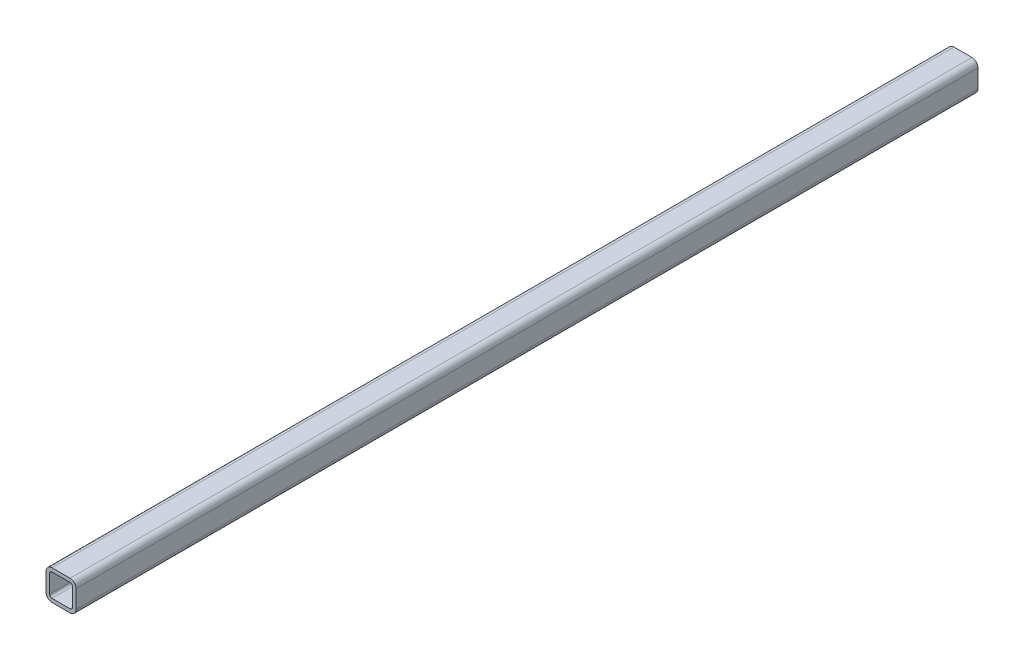
ISO-10303-21;
HEADER;
FILE_DESCRIPTION(('STEP AP214'),'2;1');
FILE_NAME('part.step','',(''),(''),'','','');
FILE_SCHEMA(('AUTOMOTIVE_DESIGN { 1 0 10303 214 1 1 1 1 }'));
ENDSEC;
DATA;
#1=APPLICATION_CONTEXT('core data for automotive mechanical design processes');
#2=APPLICATION_PROTOCOL_DEFINITION('international standard','automotive_design',2000,#1);
#3=PRODUCT_CONTEXT('',#1,'mechanical');
#4=PRODUCT('Part','Part','',(#3));
#5=PRODUCT_RELATED_PRODUCT_CATEGORY('part','',(#4));
#6=PRODUCT_DEFINITION_FORMATION('','',#4);
#7=PRODUCT_DEFINITION_CONTEXT('part definition',#1,'design');
#8=PRODUCT_DEFINITION('design','',#6,#7);
#9=PRODUCT_DEFINITION_SHAPE('','',#8);
#10=(LENGTH_UNIT() NAMED_UNIT(*) SI_UNIT(.MILLI.,.METRE.));
#11=(NAMED_UNIT(*) PLANE_ANGLE_UNIT() SI_UNIT($,.RADIAN.));
#12=(NAMED_UNIT(*) SI_UNIT($,.STERADIAN.) SOLID_ANGLE_UNIT());
#13=UNCERTAINTY_MEASURE_WITH_UNIT(LENGTH_MEASURE(1.E-05),#10,'distance_accuracy_value','');
#14=(GEOMETRIC_REPRESENTATION_CONTEXT(3) GLOBAL_UNCERTAINTY_ASSIGNED_CONTEXT((#13)) GLOBAL_UNIT_ASSIGNED_CONTEXT((#10,
#11,#12)) REPRESENTATION_CONTEXT('',''));
#15=CARTESIAN_POINT('',(0.,0.,0.));
#16=DIRECTION('',(0.,0.,1.));
#17=DIRECTION('',(1.,0.,0.));
#18=AXIS2_PLACEMENT_3D('',#15,#16,#17);
#19=CARTESIAN_POINT('',(7.5,7.5,750.));
#20=DIRECTION('',(0.,0.,-1.));
#21=DIRECTION('',(-1.,0.,0.));
#22=AXIS2_PLACEMENT_3D('',#19,#20,#21);
#23=PLANE('',#22);
#24=CARTESIAN_POINT('',(7.5,7.5,750.));
#25=DIRECTION('',(0.,0.,1.));
#26=DIRECTION('',(-1.,0.,0.));
#27=AXIS2_PLACEMENT_3D('',#24,#25,#26);
#28=CIRCLE('',#27,5.);
#29=CARTESIAN_POINT('',(12.5,7.49999999999997,750.));
#30=VERTEX_POINT('',#29);
#31=CARTESIAN_POINT('',(7.49999999999997,12.5,750.));
#32=VERTEX_POINT('',#31);
#33=EDGE_CURVE('E211',#30,#32,#28,.T.);
#34=ORIENTED_EDGE('',*,*,#33,.T.);
#35=DIRECTION('',(-1.,0.,0.));
#36=VECTOR('',#35,1.);
#37=CARTESIAN_POINT('',(-7.49999999999997,12.5,750.));
#38=LINE('',#37,#36);
#39=CARTESIAN_POINT('',(-7.49999999999997,12.5,750.));
#40=VERTEX_POINT('',#39);
#41=EDGE_CURVE('E214',#32,#40,#38,.T.);
#42=ORIENTED_EDGE('',*,*,#41,.T.);
#43=CARTESIAN_POINT('',(-7.5,7.5,750.));
#44=DIRECTION('',(0.,0.,1.));
#45=DIRECTION('',(-1.,0.,0.));
#46=AXIS2_PLACEMENT_3D('',#43,#44,#45);
#47=CIRCLE('',#46,5.);
#48=CARTESIAN_POINT('',(-12.5,7.49999999999997,750.));
#49=VERTEX_POINT('',#48);
#50=EDGE_CURVE('E217',#40,#49,#47,.T.);
#51=ORIENTED_EDGE('',*,*,#50,.T.);
#52=DIRECTION('',(0.,-1.,0.));
#53=VECTOR('',#52,1.);
#54=CARTESIAN_POINT('',(-12.5,-7.49999999999997,750.));
#55=LINE('',#54,#53);
#56=CARTESIAN_POINT('',(-12.5,-7.49999999999997,750.));
#57=VERTEX_POINT('',#56);
#58=EDGE_CURVE('E219',#49,#57,#55,.T.);
#59=ORIENTED_EDGE('',*,*,#58,.T.);
#60=CARTESIAN_POINT('',(-7.5,-7.5,750.));
#61=DIRECTION('',(0.,0.,1.));
#62=DIRECTION('',(-1.,0.,0.));
#63=AXIS2_PLACEMENT_3D('',#60,#61,#62);
#64=CIRCLE('',#63,5.);
#65=CARTESIAN_POINT('',(-7.49999999999997,-12.5,750.));
#66=VERTEX_POINT('',#65);
#67=EDGE_CURVE('E221',#57,#66,#64,.T.);
#68=ORIENTED_EDGE('',*,*,#67,.T.);
#69=DIRECTION('',(1.,0.,0.));
#70=VECTOR('',#69,1.);
#71=CARTESIAN_POINT('',(-7.49999999999997,-12.5,750.));
#72=LINE('',#71,#70);
#73=CARTESIAN_POINT('',(7.49999999999997,-12.5,750.));
#74=VERTEX_POINT('',#73);
#75=EDGE_CURVE('E223',#66,#74,#72,.T.);
#76=ORIENTED_EDGE('',*,*,#75,.T.);
#77=CARTESIAN_POINT('',(7.5,-7.5,750.));
#78=DIRECTION('',(0.,0.,1.));
#79=DIRECTION('',(1.,0.,0.));
#80=AXIS2_PLACEMENT_3D('',#77,#78,#79);
#81=CIRCLE('',#80,5.);
#82=CARTESIAN_POINT('',(12.5,-7.5,750.));
#83=VERTEX_POINT('',#82);
#84=EDGE_CURVE('E225',#74,#83,#81,.T.);
#85=ORIENTED_EDGE('',*,*,#84,.T.);
#86=DIRECTION('',(0.,1.,0.));
#87=VECTOR('',#86,1.);
#88=CARTESIAN_POINT('',(12.5,-7.49999999999997,750.));
#89=LINE('',#88,#87);
#90=EDGE_CURVE('E227',#83,#30,#89,.T.);
#91=ORIENTED_EDGE('',*,*,#90,.T.);
#92=EDGE_LOOP('',(#34,#42,#51,#59,#68,#76,#85,#91));
#93=FACE_BOUND('',#92,.T.);
#94=CARTESIAN_POINT('',(-7.49999999999999,-7.49999999999997,750.));
#95=DIRECTION('',(0.,0.,1.));
#96=DIRECTION('',(1.,0.,0.));
#97=AXIS2_PLACEMENT_3D('',#94,#95,#96);
#98=CIRCLE('',#97,2.);
#99=CARTESIAN_POINT('',(-9.49999999999999,-7.49999999999995,750.));
#100=VERTEX_POINT('',#99);
#101=CARTESIAN_POINT('',(-7.49999999999997,-9.49999999999997,750.));
#102=VERTEX_POINT('',#101);
#103=EDGE_CURVE('E146',#100,#102,#98,.T.);
#104=ORIENTED_EDGE('',*,*,#103,.F.);
#105=DIRECTION('',(0.,-1.,0.));
#106=VECTOR('',#105,1.);
#107=CARTESIAN_POINT('',(-9.49999999999999,7.49999999999998,750.));
#108=LINE('',#107,#106);
#109=CARTESIAN_POINT('',(-9.49999999999999,7.49999999999998,750.));
#110=VERTEX_POINT('',#109);
#111=EDGE_CURVE('E179',#110,#100,#108,.T.);
#112=ORIENTED_EDGE('',*,*,#111,.F.);
#113=CARTESIAN_POINT('',(-7.49999999999999,7.49999999999999,750.));
#114=DIRECTION('',(0.,0.,1.));
#115=DIRECTION('',(-1.,0.,0.));
#116=AXIS2_PLACEMENT_3D('',#113,#114,#115);
#117=CIRCLE('',#116,2.);
#118=CARTESIAN_POINT('',(-7.49999999999997,9.49999999999999,750.));
#119=VERTEX_POINT('',#118);
#120=EDGE_CURVE('E177',#119,#110,#117,.T.);
#121=ORIENTED_EDGE('',*,*,#120,.F.);
#122=DIRECTION('',(-1.,0.,0.));
#123=VECTOR('',#122,1.);
#124=CARTESIAN_POINT('',(7.49999999999994,9.49999999999996,750.));
#125=LINE('',#124,#123);
#126=CARTESIAN_POINT('',(7.49999999999994,9.49999999999996,750.));
#127=VERTEX_POINT('',#126);
#128=EDGE_CURVE('E175',#127,#119,#125,.T.);
#129=ORIENTED_EDGE('',*,*,#128,.F.);
#130=CARTESIAN_POINT('',(7.49999999999995,7.49999999999996,750.));
#131=DIRECTION('',(0.,0.,1.));
#132=DIRECTION('',(1.,0.,0.));
#133=AXIS2_PLACEMENT_3D('',#130,#131,#132);
#134=CIRCLE('',#133,2.);
#135=CARTESIAN_POINT('',(9.49999999999995,7.49999999999994,750.));
#136=VERTEX_POINT('',#135);
#137=EDGE_CURVE('E173',#136,#127,#134,.T.);
#138=ORIENTED_EDGE('',*,*,#137,.F.);
#139=DIRECTION('',(0.,1.,0.));
#140=VECTOR('',#139,1.);
#141=CARTESIAN_POINT('',(9.49999999999995,-7.49999999999995,750.));
#142=LINE('',#141,#140);
#143=CARTESIAN_POINT('',(9.49999999999995,-7.49999999999995,750.));
#144=VERTEX_POINT('',#143);
#145=EDGE_CURVE('E169',#144,#136,#142,.T.);
#146=ORIENTED_EDGE('',*,*,#145,.F.);
#147=CARTESIAN_POINT('',(7.49999999999995,-7.49999999999997,750.));
#148=DIRECTION('',(0.,0.,1.));
#149=DIRECTION('',(1.,0.,0.));
#150=AXIS2_PLACEMENT_3D('',#147,#148,#149);
#151=CIRCLE('',#150,2.);
#152=CARTESIAN_POINT('',(7.49999999999994,-9.49999999999997,750.));
#153=VERTEX_POINT('',#152);
#154=EDGE_CURVE('E167',#153,#144,#151,.T.);
#155=ORIENTED_EDGE('',*,*,#154,.F.);
#156=DIRECTION('',(1.,0.,0.));
#157=VECTOR('',#156,1.);
#158=CARTESIAN_POINT('',(-7.49999999999997,-9.49999999999997,750.));
#159=LINE('',#158,#157);
#160=EDGE_CURVE('E154',#102,#153,#159,.T.);
#161=ORIENTED_EDGE('',*,*,#160,.F.);
#162=EDGE_LOOP('',(#104,#112,#121,#129,#138,#146,#155,#161));
#163=FACE_BOUND('',#162,.T.);
#164=ADVANCED_FACE('F33',(#93,#163),#23,.F.);
#165=CARTESIAN_POINT('',(7.5,7.5,0.));
#166=DIRECTION('',(0.,0.,-1.));
#167=DIRECTION('',(-1.,0.,0.));
#168=AXIS2_PLACEMENT_3D('',#165,#166,#167);
#169=PLANE('',#168);
#170=CARTESIAN_POINT('',(7.5,7.5,0.));
#171=DIRECTION('',(0.,0.,1.));
#172=DIRECTION('',(-1.,0.,0.));
#173=AXIS2_PLACEMENT_3D('',#170,#171,#172);
#174=CIRCLE('',#173,5.);
#175=CARTESIAN_POINT('',(12.5,7.49999999999997,0.));
#176=VERTEX_POINT('',#175);
#177=CARTESIAN_POINT('',(7.49999999999997,12.5,0.));
#178=VERTEX_POINT('',#177);
#179=EDGE_CURVE('E162',#176,#178,#174,.T.);
#180=ORIENTED_EDGE('',*,*,#179,.F.);
#181=DIRECTION('',(0.,1.,0.));
#182=VECTOR('',#181,1.);
#183=CARTESIAN_POINT('',(12.5,-7.49999999999997,0.));
#184=LINE('',#183,#182);
#185=CARTESIAN_POINT('',(12.5,-7.5,0.));
#186=VERTEX_POINT('',#185);
#187=EDGE_CURVE('E215',#186,#176,#184,.T.);
#188=ORIENTED_EDGE('',*,*,#187,.F.);
#189=CARTESIAN_POINT('',(7.5,-7.5,0.));
#190=DIRECTION('',(0.,0.,1.));
#191=DIRECTION('',(1.,0.,0.));
#192=AXIS2_PLACEMENT_3D('',#189,#190,#191);
#193=CIRCLE('',#192,5.);
#194=CARTESIAN_POINT('',(7.49999999999997,-12.5,0.));
#195=VERTEX_POINT('',#194);
#196=EDGE_CURVE('E242',#195,#186,#193,.T.);
#197=ORIENTED_EDGE('',*,*,#196,.F.);
#198=DIRECTION('',(1.,0.,0.));
#199=VECTOR('',#198,1.);
#200=CARTESIAN_POINT('',(-7.49999999999997,-12.5,0.));
#201=LINE('',#200,#199);
#202=CARTESIAN_POINT('',(-7.49999999999997,-12.5,0.));
#203=VERTEX_POINT('',#202);
#204=EDGE_CURVE('E240',#203,#195,#201,.T.);
#205=ORIENTED_EDGE('',*,*,#204,.F.);
#206=CARTESIAN_POINT('',(-7.5,-7.5,0.));
#207=DIRECTION('',(0.,0.,1.));
#208=DIRECTION('',(-1.,0.,0.));
#209=AXIS2_PLACEMENT_3D('',#206,#207,#208);
#210=CIRCLE('',#209,5.);
#211=CARTESIAN_POINT('',(-12.5,-7.49999999999997,0.));
#212=VERTEX_POINT('',#211);
#213=EDGE_CURVE('E238',#212,#203,#210,.T.);
#214=ORIENTED_EDGE('',*,*,#213,.F.);
#215=DIRECTION('',(0.,-1.,0.));
#216=VECTOR('',#215,1.);
#217=CARTESIAN_POINT('',(-12.5,-7.49999999999997,0.));
#218=LINE('',#217,#216);
#219=CARTESIAN_POINT('',(-12.5,7.49999999999997,0.));
#220=VERTEX_POINT('',#219);
#221=EDGE_CURVE('E236',#220,#212,#218,.T.);
#222=ORIENTED_EDGE('',*,*,#221,.F.);
#223=CARTESIAN_POINT('',(-7.5,7.5,0.));
#224=DIRECTION('',(0.,0.,1.));
#225=DIRECTION('',(-1.,0.,0.));
#226=AXIS2_PLACEMENT_3D('',#223,#224,#225);
#227=CIRCLE('',#226,5.);
#228=CARTESIAN_POINT('',(-7.49999999999997,12.5,0.));
#229=VERTEX_POINT('',#228);
#230=EDGE_CURVE('E234',#229,#220,#227,.T.);
#231=ORIENTED_EDGE('',*,*,#230,.F.);
#232=DIRECTION('',(-1.,0.,0.));
#233=VECTOR('',#232,1.);
#234=CARTESIAN_POINT('',(-7.49999999999997,12.5,0.));
#235=LINE('',#234,#233);
#236=EDGE_CURVE('E232',#178,#229,#235,.T.);
#237=ORIENTED_EDGE('',*,*,#236,.F.);
#238=EDGE_LOOP('',(#180,#188,#197,#205,#214,#222,#231,#237));
#239=FACE_BOUND('',#238,.T.);
#240=DIRECTION('',(0.,-1.,0.));
#241=VECTOR('',#240,1.);
#242=CARTESIAN_POINT('',(-9.49999999999999,7.49999999999998,0.));
#243=LINE('',#242,#241);
#244=CARTESIAN_POINT('',(-9.49999999999999,7.49999999999998,0.));
#245=VERTEX_POINT('',#244);
#246=CARTESIAN_POINT('',(-9.49999999999998,-7.49999999999995,0.));
#247=VERTEX_POINT('',#246);
#248=EDGE_CURVE('E155',#245,#247,#243,.T.);
#249=ORIENTED_EDGE('',*,*,#248,.T.);
#250=CARTESIAN_POINT('',(-7.49999999999999,-7.49999999999997,0.));
#251=DIRECTION('',(0.,0.,1.));
#252=DIRECTION('',(1.,0.,0.));
#253=AXIS2_PLACEMENT_3D('',#250,#251,#252);
#254=CIRCLE('',#253,2.);
#255=CARTESIAN_POINT('',(-7.49999999999997,-9.49999999999997,0.));
#256=VERTEX_POINT('',#255);
#257=EDGE_CURVE('E56',#247,#256,#254,.T.);
#258=ORIENTED_EDGE('',*,*,#257,.T.);
#259=DIRECTION('',(1.,0.,0.));
#260=VECTOR('',#259,1.);
#261=CARTESIAN_POINT('',(-7.49999999999997,-9.49999999999997,0.));
#262=LINE('',#261,#260);
#263=CARTESIAN_POINT('',(7.49999999999994,-9.49999999999997,0.));
#264=VERTEX_POINT('',#263);
#265=EDGE_CURVE('E161',#256,#264,#262,.T.);
#266=ORIENTED_EDGE('',*,*,#265,.T.);
#267=CARTESIAN_POINT('',(7.49999999999995,-7.49999999999997,0.));
#268=DIRECTION('',(0.,0.,1.));
#269=DIRECTION('',(1.,0.,0.));
#270=AXIS2_PLACEMENT_3D('',#267,#268,#269);
#271=CIRCLE('',#270,2.);
#272=CARTESIAN_POINT('',(9.49999999999995,-7.49999999999995,0.));
#273=VERTEX_POINT('',#272);
#274=EDGE_CURVE('E183',#264,#273,#271,.T.);
#275=ORIENTED_EDGE('',*,*,#274,.T.);
#276=DIRECTION('',(0.,1.,0.));
#277=VECTOR('',#276,1.);
#278=CARTESIAN_POINT('',(9.49999999999995,-7.49999999999995,0.));
#279=LINE('',#278,#277);
#280=CARTESIAN_POINT('',(9.49999999999995,7.49999999999994,0.));
#281=VERTEX_POINT('',#280);
#282=EDGE_CURVE('E186',#273,#281,#279,.T.);
#283=ORIENTED_EDGE('',*,*,#282,.T.);
#284=CARTESIAN_POINT('',(7.49999999999995,7.49999999999996,0.));
#285=DIRECTION('',(0.,0.,1.));
#286=DIRECTION('',(1.,0.,0.));
#287=AXIS2_PLACEMENT_3D('',#284,#285,#286);
#288=CIRCLE('',#287,2.);
#289=CARTESIAN_POINT('',(7.49999999999994,9.49999999999996,0.));
#290=VERTEX_POINT('',#289);
#291=EDGE_CURVE('E189',#281,#290,#288,.T.);
#292=ORIENTED_EDGE('',*,*,#291,.T.);
#293=DIRECTION('',(-1.,0.,0.));
#294=VECTOR('',#293,1.);
#295=CARTESIAN_POINT('',(7.49999999999994,9.49999999999996,0.));
#296=LINE('',#295,#294);
#297=CARTESIAN_POINT('',(-7.49999999999997,9.49999999999999,0.));
#298=VERTEX_POINT('',#297);
#299=EDGE_CURVE('E192',#290,#298,#296,.T.);
#300=ORIENTED_EDGE('',*,*,#299,.T.);
#301=CARTESIAN_POINT('',(-7.49999999999999,7.49999999999999,0.));
#302=DIRECTION('',(0.,0.,1.));
#303=DIRECTION('',(-1.,0.,0.));
#304=AXIS2_PLACEMENT_3D('',#301,#302,#303);
#305=CIRCLE('',#304,2.);
#306=EDGE_CURVE('E195',#298,#245,#305,.T.);
#307=ORIENTED_EDGE('',*,*,#306,.T.);
#308=EDGE_LOOP('',(#249,#258,#266,#275,#283,#292,#300,#307));
#309=FACE_BOUND('',#308,.T.);
#310=ADVANCED_FACE('F272',(#239,#309),#169,.T.);
#311=CARTESIAN_POINT('',(7.5,7.5,750.));
#312=DIRECTION('',(0.,0.,-1.));
#313=DIRECTION('',(-1.,0.,0.));
#314=AXIS2_PLACEMENT_3D('',#311,#312,#313);
#315=CYLINDRICAL_SURFACE('',#314,5.);
#316=ORIENTED_EDGE('',*,*,#179,.T.);
#317=DIRECTION('',(0.,0.,-1.));
#318=VECTOR('',#317,1.);
#319=CARTESIAN_POINT('',(7.49999999999997,12.5,750.));
#320=LINE('',#319,#318);
#321=EDGE_CURVE('E11',#32,#178,#320,.T.);
#322=ORIENTED_EDGE('',*,*,#321,.F.);
#323=ORIENTED_EDGE('',*,*,#33,.F.);
#324=DIRECTION('',(0.,0.,-1.));
#325=VECTOR('',#324,1.);
#326=CARTESIAN_POINT('',(12.5,7.49999999999997,750.));
#327=LINE('',#326,#325);
#328=EDGE_CURVE('E229',#30,#176,#327,.T.);
#329=ORIENTED_EDGE('',*,*,#328,.T.);
#330=EDGE_LOOP('',(#316,#322,#323,#329));
#331=FACE_BOUND('',#330,.T.);
#332=ADVANCED_FACE('F35',(#331),#315,.T.);
#333=CARTESIAN_POINT('',(-7.49999999999997,12.5,750.));
#334=DIRECTION('',(0.,-1.,0.));
#335=DIRECTION('',(0.,0.,-1.));
#336=AXIS2_PLACEMENT_3D('',#333,#334,#335);
#337=PLANE('',#336);
#338=ORIENTED_EDGE('',*,*,#236,.T.);
#339=DIRECTION('',(0.,0.,-1.));
#340=VECTOR('',#339,1.);
#341=CARTESIAN_POINT('',(-7.49999999999997,12.5,750.));
#342=LINE('',#341,#340);
#343=EDGE_CURVE('E41',#40,#229,#342,.T.);
#344=ORIENTED_EDGE('',*,*,#343,.F.);
#345=ORIENTED_EDGE('',*,*,#41,.F.);
#346=ORIENTED_EDGE('',*,*,#321,.T.);
#347=EDGE_LOOP('',(#338,#344,#345,#346));
#348=FACE_BOUND('',#347,.T.);
#349=ADVANCED_FACE('F289',(#348),#337,.F.);
#350=CARTESIAN_POINT('',(-7.5,7.5,750.));
#351=DIRECTION('',(0.,0.,-1.));
#352=DIRECTION('',(-1.,0.,0.));
#353=AXIS2_PLACEMENT_3D('',#350,#351,#352);
#354=CYLINDRICAL_SURFACE('',#353,5.);
#355=ORIENTED_EDGE('',*,*,#230,.T.);
#356=DIRECTION('',(0.,0.,-1.));
#357=VECTOR('',#356,1.);
#358=CARTESIAN_POINT('',(-12.5,7.49999999999997,750.));
#359=LINE('',#358,#357);
#360=EDGE_CURVE('E259',#49,#220,#359,.T.);
#361=ORIENTED_EDGE('',*,*,#360,.F.);
#362=ORIENTED_EDGE('',*,*,#50,.F.);
#363=ORIENTED_EDGE('',*,*,#343,.T.);
#364=EDGE_LOOP('',(#355,#361,#362,#363));
#365=FACE_BOUND('',#364,.T.);
#366=ADVANCED_FACE('F266',(#365),#354,.T.);
#367=CARTESIAN_POINT('',(-12.5,-7.49999999999997,750.));
#368=DIRECTION('',(1.,0.,0.));
#369=DIRECTION('',(0.,0.,-1.));
#370=AXIS2_PLACEMENT_3D('',#367,#368,#369);
#371=PLANE('',#370);
#372=ORIENTED_EDGE('',*,*,#221,.T.);
#373=DIRECTION('',(0.,0.,-1.));
#374=VECTOR('',#373,1.);
#375=CARTESIAN_POINT('',(-12.5,-7.49999999999997,750.));
#376=LINE('',#375,#374);
#377=EDGE_CURVE('E256',#57,#212,#376,.T.);
#378=ORIENTED_EDGE('',*,*,#377,.F.);
#379=ORIENTED_EDGE('',*,*,#58,.F.);
#380=ORIENTED_EDGE('',*,*,#360,.T.);
#381=EDGE_LOOP('',(#372,#378,#379,#380));
#382=FACE_BOUND('',#381,.T.);
#383=ADVANCED_FACE('F278',(#382),#371,.F.);
#384=CARTESIAN_POINT('',(-7.5,-7.5,750.));
#385=DIRECTION('',(0.,0.,-1.));
#386=DIRECTION('',(-1.,0.,0.));
#387=AXIS2_PLACEMENT_3D('',#384,#385,#386);
#388=CYLINDRICAL_SURFACE('',#387,5.);
#389=ORIENTED_EDGE('',*,*,#213,.T.);
#390=DIRECTION('',(0.,0.,-1.));
#391=VECTOR('',#390,1.);
#392=CARTESIAN_POINT('',(-7.49999999999997,-12.5,750.));
#393=LINE('',#392,#391);
#394=EDGE_CURVE('E253',#66,#203,#393,.T.);
#395=ORIENTED_EDGE('',*,*,#394,.F.);
#396=ORIENTED_EDGE('',*,*,#67,.F.);
#397=ORIENTED_EDGE('',*,*,#377,.T.);
#398=EDGE_LOOP('',(#389,#395,#396,#397));
#399=FACE_BOUND('',#398,.T.);
#400=ADVANCED_FACE('F282',(#399),#388,.T.);
#401=CARTESIAN_POINT('',(-7.49999999999997,-12.5,750.));
#402=DIRECTION('',(0.,1.,0.));
#403=DIRECTION('',(0.,0.,1.));
#404=AXIS2_PLACEMENT_3D('',#401,#402,#403);
#405=PLANE('',#404);
#406=ORIENTED_EDGE('',*,*,#204,.T.);
#407=DIRECTION('',(0.,0.,-1.));
#408=VECTOR('',#407,1.);
#409=CARTESIAN_POINT('',(7.49999999999997,-12.5,750.));
#410=LINE('',#409,#408);
#411=EDGE_CURVE('E250',#74,#195,#410,.T.);
#412=ORIENTED_EDGE('',*,*,#411,.F.);
#413=ORIENTED_EDGE('',*,*,#75,.F.);
#414=ORIENTED_EDGE('',*,*,#394,.T.);
#415=EDGE_LOOP('',(#406,#412,#413,#414));
#416=FACE_BOUND('',#415,.T.);
#417=ADVANCED_FACE('F302',(#416),#405,.F.);
#418=CARTESIAN_POINT('',(7.5,-7.5,750.));
#419=DIRECTION('',(0.,0.,-1.));
#420=DIRECTION('',(-1.,0.,0.));
#421=AXIS2_PLACEMENT_3D('',#418,#419,#420);
#422=CYLINDRICAL_SURFACE('',#421,5.);
#423=ORIENTED_EDGE('',*,*,#196,.T.);
#424=DIRECTION('',(0.,0.,-1.));
#425=VECTOR('',#424,1.);
#426=CARTESIAN_POINT('',(12.5,-7.5,750.));
#427=LINE('',#426,#425);
#428=EDGE_CURVE('E247',#83,#186,#427,.T.);
#429=ORIENTED_EDGE('',*,*,#428,.F.);
#430=ORIENTED_EDGE('',*,*,#84,.F.);
#431=ORIENTED_EDGE('',*,*,#411,.T.);
#432=EDGE_LOOP('',(#423,#429,#430,#431));
#433=FACE_BOUND('',#432,.T.);
#434=ADVANCED_FACE('F300',(#433),#422,.T.);
#435=CARTESIAN_POINT('',(12.5,-7.49999999999997,750.));
#436=DIRECTION('',(-1.,0.,0.));
#437=DIRECTION('',(0.,0.,1.));
#438=AXIS2_PLACEMENT_3D('',#435,#436,#437);
#439=PLANE('',#438);
#440=ORIENTED_EDGE('',*,*,#187,.T.);
#441=ORIENTED_EDGE('',*,*,#328,.F.);
#442=ORIENTED_EDGE('',*,*,#90,.F.);
#443=ORIENTED_EDGE('',*,*,#428,.T.);
#444=EDGE_LOOP('',(#440,#441,#442,#443));
#445=FACE_BOUND('',#444,.T.);
#446=ADVANCED_FACE('F295',(#445),#439,.F.);
#447=CARTESIAN_POINT('',(-7.49999999999999,-7.49999999999997,750.));
#448=DIRECTION('',(0.,0.,-1.));
#449=DIRECTION('',(-1.,0.,0.));
#450=AXIS2_PLACEMENT_3D('',#447,#448,#449);
#451=CYLINDRICAL_SURFACE('',#450,2.);
#452=ORIENTED_EDGE('',*,*,#257,.F.);
#453=DIRECTION('',(0.,0.,-1.));
#454=VECTOR('',#453,1.);
#455=CARTESIAN_POINT('',(-9.49999999999999,-7.49999999999995,750.));
#456=LINE('',#455,#454);
#457=EDGE_CURVE('E150',#100,#247,#456,.T.);
#458=ORIENTED_EDGE('',*,*,#457,.F.);
#459=ORIENTED_EDGE('',*,*,#103,.T.);
#460=DIRECTION('',(0.,0.,-1.));
#461=VECTOR('',#460,1.);
#462=CARTESIAN_POINT('',(-7.49999999999997,-9.49999999999997,750.));
#463=LINE('',#462,#461);
#464=EDGE_CURVE('E149',#102,#256,#463,.T.);
#465=ORIENTED_EDGE('',*,*,#464,.T.);
#466=EDGE_LOOP('',(#452,#458,#459,#465));
#467=FACE_BOUND('',#466,.T.);
#468=ADVANCED_FACE('F148',(#467),#451,.F.);
#469=CARTESIAN_POINT('',(-7.49999999999997,-9.49999999999997,750.));
#470=DIRECTION('',(0.,1.,0.));
#471=DIRECTION('',(0.,0.,1.));
#472=AXIS2_PLACEMENT_3D('',#469,#470,#471);
#473=PLANE('',#472);
#474=ORIENTED_EDGE('',*,*,#265,.F.);
#475=ORIENTED_EDGE('',*,*,#464,.F.);
#476=ORIENTED_EDGE('',*,*,#160,.T.);
#477=DIRECTION('',(0.,0.,-1.));
#478=VECTOR('',#477,1.);
#479=CARTESIAN_POINT('',(7.49999999999994,-9.49999999999997,750.));
#480=LINE('',#479,#478);
#481=EDGE_CURVE('E163',#153,#264,#480,.T.);
#482=ORIENTED_EDGE('',*,*,#481,.T.);
#483=EDGE_LOOP('',(#474,#475,#476,#482));
#484=FACE_BOUND('',#483,.T.);
#485=ADVANCED_FACE('F158',(#484),#473,.T.);
#486=CARTESIAN_POINT('',(7.49999999999995,-7.49999999999997,750.));
#487=DIRECTION('',(0.,0.,-1.));
#488=DIRECTION('',(-1.,0.,0.));
#489=AXIS2_PLACEMENT_3D('',#486,#487,#488);
#490=CYLINDRICAL_SURFACE('',#489,2.);
#491=ORIENTED_EDGE('',*,*,#274,.F.);
#492=ORIENTED_EDGE('',*,*,#481,.F.);
#493=ORIENTED_EDGE('',*,*,#154,.T.);
#494=DIRECTION('',(0.,0.,-1.));
#495=VECTOR('',#494,1.);
#496=CARTESIAN_POINT('',(9.49999999999995,-7.49999999999995,750.));
#497=LINE('',#496,#495);
#498=EDGE_CURVE('E208',#144,#273,#497,.T.);
#499=ORIENTED_EDGE('',*,*,#498,.T.);
#500=EDGE_LOOP('',(#491,#492,#493,#499));
#501=FACE_BOUND('',#500,.T.);
#502=ADVANCED_FACE('F327',(#501),#490,.F.);
#503=CARTESIAN_POINT('',(9.49999999999995,-7.49999999999995,750.));
#504=DIRECTION('',(-1.,0.,0.));
#505=DIRECTION('',(0.,0.,1.));
#506=AXIS2_PLACEMENT_3D('',#503,#504,#505);
#507=PLANE('',#506);
#508=ORIENTED_EDGE('',*,*,#282,.F.);
#509=ORIENTED_EDGE('',*,*,#498,.F.);
#510=ORIENTED_EDGE('',*,*,#145,.T.);
#511=DIRECTION('',(0.,0.,-1.));
#512=VECTOR('',#511,1.);
#513=CARTESIAN_POINT('',(9.49999999999995,7.49999999999994,750.));
#514=LINE('',#513,#512);
#515=EDGE_CURVE('E206',#136,#281,#514,.T.);
#516=ORIENTED_EDGE('',*,*,#515,.T.);
#517=EDGE_LOOP('',(#508,#509,#510,#516));
#518=FACE_BOUND('',#517,.T.);
#519=ADVANCED_FACE('F331',(#518),#507,.T.);
#520=CARTESIAN_POINT('',(7.49999999999995,7.49999999999996,750.));
#521=DIRECTION('',(0.,0.,-1.));
#522=DIRECTION('',(-1.,0.,0.));
#523=AXIS2_PLACEMENT_3D('',#520,#521,#522);
#524=CYLINDRICAL_SURFACE('',#523,2.);
#525=ORIENTED_EDGE('',*,*,#291,.F.);
#526=ORIENTED_EDGE('',*,*,#515,.F.);
#527=ORIENTED_EDGE('',*,*,#137,.T.);
#528=DIRECTION('',(0.,0.,-1.));
#529=VECTOR('',#528,1.);
#530=CARTESIAN_POINT('',(7.49999999999994,9.49999999999996,750.));
#531=LINE('',#530,#529);
#532=EDGE_CURVE('E204',#127,#290,#531,.T.);
#533=ORIENTED_EDGE('',*,*,#532,.T.);
#534=EDGE_LOOP('',(#525,#526,#527,#533));
#535=FACE_BOUND('',#534,.T.);
#536=ADVANCED_FACE('F337',(#535),#524,.F.);
#537=CARTESIAN_POINT('',(7.49999999999994,9.49999999999996,750.));
#538=DIRECTION('',(0.,-1.,0.));
#539=DIRECTION('',(1.,0.,0.));
#540=AXIS2_PLACEMENT_3D('',#537,#538,#539);
#541=PLANE('',#540);
#542=ORIENTED_EDGE('',*,*,#299,.F.);
#543=ORIENTED_EDGE('',*,*,#532,.F.);
#544=ORIENTED_EDGE('',*,*,#128,.T.);
#545=DIRECTION('',(0.,0.,-1.));
#546=VECTOR('',#545,1.);
#547=CARTESIAN_POINT('',(-7.49999999999997,9.49999999999999,750.));
#548=LINE('',#547,#546);
#549=EDGE_CURVE('E202',#119,#298,#548,.T.);
#550=ORIENTED_EDGE('',*,*,#549,.T.);
#551=EDGE_LOOP('',(#542,#543,#544,#550));
#552=FACE_BOUND('',#551,.T.);
#553=ADVANCED_FACE('F341',(#552),#541,.T.);
#554=CARTESIAN_POINT('',(-7.49999999999999,7.49999999999999,750.));
#555=DIRECTION('',(0.,0.,-1.));
#556=DIRECTION('',(-1.,0.,0.));
#557=AXIS2_PLACEMENT_3D('',#554,#555,#556);
#558=CYLINDRICAL_SURFACE('',#557,2.);
#559=ORIENTED_EDGE('',*,*,#306,.F.);
#560=ORIENTED_EDGE('',*,*,#549,.F.);
#561=ORIENTED_EDGE('',*,*,#120,.T.);
#562=DIRECTION('',(0.,0.,-1.));
#563=VECTOR('',#562,1.);
#564=CARTESIAN_POINT('',(-9.49999999999999,7.49999999999998,750.));
#565=LINE('',#564,#563);
#566=EDGE_CURVE('E48',#110,#245,#565,.T.);
#567=ORIENTED_EDGE('',*,*,#566,.T.);
#568=EDGE_LOOP('',(#559,#560,#561,#567));
#569=FACE_BOUND('',#568,.T.);
#570=ADVANCED_FACE('F345',(#569),#558,.F.);
#571=CARTESIAN_POINT('',(-9.49999999999999,7.49999999999998,750.));
#572=DIRECTION('',(1.,0.,0.));
#573=DIRECTION('',(0.,1.,0.));
#574=AXIS2_PLACEMENT_3D('',#571,#572,#573);
#575=PLANE('',#574);
#576=ORIENTED_EDGE('',*,*,#248,.F.);
#577=ORIENTED_EDGE('',*,*,#566,.F.);
#578=ORIENTED_EDGE('',*,*,#111,.T.);
#579=ORIENTED_EDGE('',*,*,#457,.T.);
#580=EDGE_LOOP('',(#576,#577,#578,#579));
#581=FACE_BOUND('',#580,.T.);
#582=ADVANCED_FACE('F349',(#581),#575,.T.);
#583=CLOSED_SHELL('',(#164,#310,#332,#349,#366,#383,#400,#417,#434,#446,#468,#485,#502,#519,
#536,#553,#570,#582));
#584=MANIFOLD_SOLID_BREP('B2',#583);
#585=ADVANCED_BREP_SHAPE_REPRESENTATION('',(#18,#584),#14);
#586=SHAPE_DEFINITION_REPRESENTATION(#9,#585);
ENDSEC;
END-ISO-10303-21;
